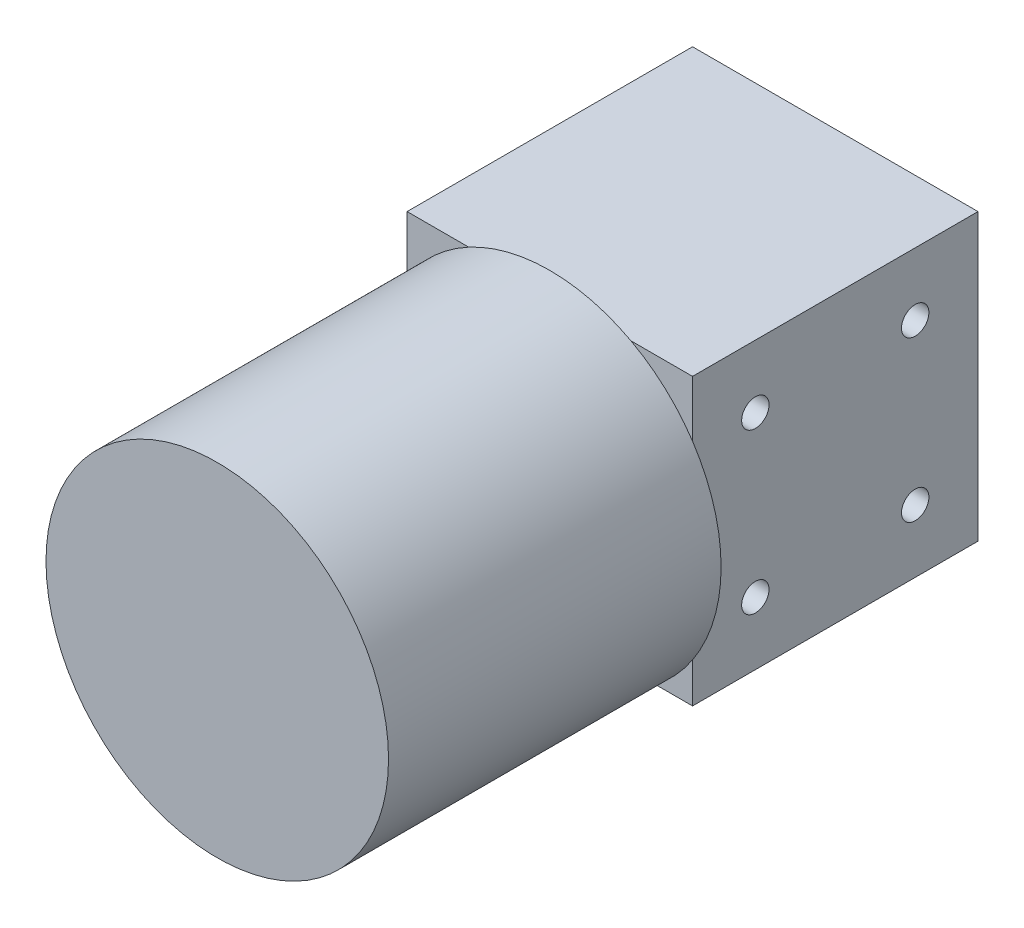
ISO-10303-21;
HEADER;
FILE_DESCRIPTION(('STEP AP214'),'2;1');
FILE_NAME('part.step','',(''),(''),'','','');
FILE_SCHEMA(('AUTOMOTIVE_DESIGN { 1 0 10303 214 1 1 1 1 }'));
ENDSEC;
DATA;
#1=APPLICATION_CONTEXT('core data for automotive mechanical design processes');
#2=APPLICATION_PROTOCOL_DEFINITION('international standard','automotive_design',2000,#1);
#3=PRODUCT_CONTEXT('',#1,'mechanical');
#4=PRODUCT('Part','Part','',(#3));
#5=PRODUCT_RELATED_PRODUCT_CATEGORY('part','',(#4));
#6=PRODUCT_DEFINITION_FORMATION('','',#4);
#7=PRODUCT_DEFINITION_CONTEXT('part definition',#1,'design');
#8=PRODUCT_DEFINITION('design','',#6,#7);
#9=PRODUCT_DEFINITION_SHAPE('','',#8);
#10=(LENGTH_UNIT() NAMED_UNIT(*) SI_UNIT(.MILLI.,.METRE.));
#11=(NAMED_UNIT(*) PLANE_ANGLE_UNIT() SI_UNIT($,.RADIAN.));
#12=(NAMED_UNIT(*) SI_UNIT($,.STERADIAN.) SOLID_ANGLE_UNIT());
#13=UNCERTAINTY_MEASURE_WITH_UNIT(LENGTH_MEASURE(1.E-05),#10,'distance_accuracy_value','');
#14=(GEOMETRIC_REPRESENTATION_CONTEXT(3) GLOBAL_UNCERTAINTY_ASSIGNED_CONTEXT((#13)) GLOBAL_UNIT_ASSIGNED_CONTEXT((#10,
#11,#12)) REPRESENTATION_CONTEXT('',''));
#15=CARTESIAN_POINT('',(0.,0.,0.));
#16=DIRECTION('',(0.,0.,1.));
#17=DIRECTION('',(1.,0.,0.));
#18=AXIS2_PLACEMENT_3D('',#15,#16,#17);
#19=CARTESIAN_POINT('',(0.,0.,50.));
#20=DIRECTION('',(0.,0.,-1.));
#21=DIRECTION('',(-1.,0.,0.));
#22=AXIS2_PLACEMENT_3D('',#19,#20,#21);
#23=PLANE('',#22);
#24=CARTESIAN_POINT('',(25.,0.,50.));
#25=DIRECTION('',(0.,0.,1.));
#26=DIRECTION('',(1.,0.,0.));
#27=AXIS2_PLACEMENT_3D('',#24,#25,#26);
#28=CIRCLE('',#27,30.);
#29=CARTESIAN_POINT('',(50.,16.583123951777,50.));
#30=VERTEX_POINT('',#29);
#31=CARTESIAN_POINT('',(39.2087450069061,26.4218009478673,50.));
#32=VERTEX_POINT('',#31);
#33=EDGE_CURVE('E134',#30,#32,#28,.T.);
#34=ORIENTED_EDGE('',*,*,#33,.F.);
#35=DIRECTION('',(0.,1.,0.));
#36=VECTOR('',#35,1.);
#37=CARTESIAN_POINT('',(50.,-23.5781990521327,50.));
#38=LINE('',#37,#36);
#39=CARTESIAN_POINT('',(50.,26.4218009478673,50.));
#40=VERTEX_POINT('',#39);
#41=EDGE_CURVE('E116',#30,#40,#38,.T.);
#42=ORIENTED_EDGE('',*,*,#41,.T.);
#43=DIRECTION('',(-1.,0.,0.));
#44=VECTOR('',#43,1.);
#45=CARTESIAN_POINT('',(0.,26.4218009478673,50.));
#46=LINE('',#45,#44);
#47=EDGE_CURVE('E164',#40,#32,#46,.T.);
#48=ORIENTED_EDGE('',*,*,#47,.T.);
#49=EDGE_LOOP('',(#34,#42,#48));
#50=FACE_BOUND('',#49,.T.);
#51=ADVANCED_FACE('F39',(#50),#23,.F.);
#52=CARTESIAN_POINT('',(10.7912549930939,26.4218009478673,50.));
#53=VERTEX_POINT('',#52);
#54=CARTESIAN_POINT('',(0.,16.583123951777,50.));
#55=VERTEX_POINT('',#54);
#56=EDGE_CURVE('E11',#53,#55,#28,.T.);
#57=ORIENTED_EDGE('',*,*,#56,.F.);
#58=CARTESIAN_POINT('',(0.,26.4218009478673,50.));
#59=VERTEX_POINT('',#58);
#60=EDGE_CURVE('E117',#53,#59,#46,.T.);
#61=ORIENTED_EDGE('',*,*,#60,.T.);
#62=DIRECTION('',(0.,-1.,0.));
#63=VECTOR('',#62,1.);
#64=CARTESIAN_POINT('',(0.,-23.5781990521327,50.));
#65=LINE('',#64,#63);
#66=EDGE_CURVE('E160',#59,#55,#65,.T.);
#67=ORIENTED_EDGE('',*,*,#66,.T.);
#68=EDGE_LOOP('',(#57,#61,#67));
#69=FACE_BOUND('',#68,.T.);
#70=ADVANCED_FACE('F189',(#69),#23,.F.);
#71=CARTESIAN_POINT('',(0.,-16.583123951777,50.));
#72=VERTEX_POINT('',#71);
#73=CARTESIAN_POINT('',(6.45091567063191,-23.5781990521327,50.));
#74=VERTEX_POINT('',#73);
#75=EDGE_CURVE('E48',#72,#74,#28,.T.);
#76=ORIENTED_EDGE('',*,*,#75,.F.);
#77=CARTESIAN_POINT('',(0.,-23.5781990521327,50.));
#78=VERTEX_POINT('',#77);
#79=EDGE_CURVE('E158',#72,#78,#65,.T.);
#80=ORIENTED_EDGE('',*,*,#79,.T.);
#81=DIRECTION('',(1.,0.,0.));
#82=VECTOR('',#81,1.);
#83=CARTESIAN_POINT('',(0.,-23.5781990521327,50.));
#84=LINE('',#83,#82);
#85=EDGE_CURVE('E161',#78,#74,#84,.T.);
#86=ORIENTED_EDGE('',*,*,#85,.T.);
#87=EDGE_LOOP('',(#76,#80,#86));
#88=FACE_BOUND('',#87,.T.);
#89=ADVANCED_FACE('F207',(#88),#23,.F.);
#90=CARTESIAN_POINT('',(0.,-23.5781990521327,50.));
#91=DIRECTION('',(1.,0.,0.));
#92=DIRECTION('',(0.,1.,0.));
#93=AXIS2_PLACEMENT_3D('',#90,#91,#92);
#94=PLANE('',#93);
#95=CARTESIAN_POINT('',(0.,-12.5781990521327,11.0000000000003));
#96=DIRECTION('',(-1.,0.,0.));
#97=DIRECTION('',(0.,-1.,0.));
#98=AXIS2_PLACEMENT_3D('',#95,#96,#97);
#99=CIRCLE('',#98,2.4);
#100=CARTESIAN_POINT('',(0.,-14.9781990521327,11.0000000000003));
#101=VERTEX_POINT('',#100);
#102=EDGE_CURVE('E443',#101,#101,#99,.T.);
#103=ORIENTED_EDGE('',*,*,#102,.F.);
#104=EDGE_LOOP('',(#103));
#105=FACE_BOUND('',#104,.T.);
#106=CARTESIAN_POINT('',(0.,-12.5781990521327,39.0000000000003));
#107=DIRECTION('',(-1.,0.,0.));
#108=DIRECTION('',(0.,-1.,0.));
#109=AXIS2_PLACEMENT_3D('',#106,#107,#108);
#110=CIRCLE('',#109,2.39999999999999);
#111=CARTESIAN_POINT('',(0.,-14.9781990521327,39.0000000000003));
#112=VERTEX_POINT('',#111);
#113=EDGE_CURVE('E566',#112,#112,#110,.T.);
#114=ORIENTED_EDGE('',*,*,#113,.F.);
#115=EDGE_LOOP('',(#114));
#116=FACE_BOUND('',#115,.T.);
#117=CARTESIAN_POINT('',(0.,15.4218009478673,39.));
#118=DIRECTION('',(-1.,0.,0.));
#119=DIRECTION('',(0.,-1.,0.));
#120=AXIS2_PLACEMENT_3D('',#117,#118,#119);
#121=CIRCLE('',#120,2.39999999999999);
#122=CARTESIAN_POINT('',(0.,13.0218009478673,39.));
#123=VERTEX_POINT('',#122);
#124=EDGE_CURVE('E459',#123,#123,#121,.T.);
#125=ORIENTED_EDGE('',*,*,#124,.F.);
#126=EDGE_LOOP('',(#125));
#127=FACE_BOUND('',#126,.T.);
#128=CARTESIAN_POINT('',(0.,15.4218009478673,11.));
#129=DIRECTION('',(-1.,0.,0.));
#130=DIRECTION('',(0.,-1.,0.));
#131=AXIS2_PLACEMENT_3D('',#128,#129,#130);
#132=CIRCLE('',#131,2.4);
#133=CARTESIAN_POINT('',(0.,13.0218009478673,11.));
#134=VERTEX_POINT('',#133);
#135=EDGE_CURVE('E457',#134,#134,#132,.T.);
#136=ORIENTED_EDGE('',*,*,#135,.F.);
#137=EDGE_LOOP('',(#136));
#138=FACE_BOUND('',#137,.T.);
#139=DIRECTION('',(0.,-1.,0.));
#140=VECTOR('',#139,1.);
#141=CARTESIAN_POINT('',(0.,-23.5781990521327,0.));
#142=LINE('',#141,#140);
#143=CARTESIAN_POINT('',(0.,26.4218009478673,0.));
#144=VERTEX_POINT('',#143);
#145=CARTESIAN_POINT('',(0.,-23.5781990521327,0.));
#146=VERTEX_POINT('',#145);
#147=EDGE_CURVE('E144',#144,#146,#142,.T.);
#148=ORIENTED_EDGE('',*,*,#147,.T.);
#149=DIRECTION('',(0.,0.,-1.));
#150=VECTOR('',#149,1.);
#151=CARTESIAN_POINT('',(0.,-23.5781990521327,50.));
#152=LINE('',#151,#150);
#153=EDGE_CURVE('E43',#78,#146,#152,.T.);
#154=ORIENTED_EDGE('',*,*,#153,.F.);
#155=ORIENTED_EDGE('',*,*,#79,.F.);
#156=EDGE_CURVE('E153',#55,#72,#65,.T.);
#157=ORIENTED_EDGE('',*,*,#156,.F.);
#158=ORIENTED_EDGE('',*,*,#66,.F.);
#159=DIRECTION('',(0.,0.,-1.));
#160=VECTOR('',#159,1.);
#161=CARTESIAN_POINT('',(0.,26.4218009478673,50.));
#162=LINE('',#161,#160);
#163=EDGE_CURVE('E170',#59,#144,#162,.T.);
#164=ORIENTED_EDGE('',*,*,#163,.T.);
#165=EDGE_LOOP('',(#148,#154,#155,#157,#158,#164));
#166=FACE_BOUND('',#165,.T.);
#167=ADVANCED_FACE('F41',(#105,#116,#127,#138,#166),#94,.F.);
#168=CARTESIAN_POINT('',(0.,-23.5781990521327,50.));
#169=DIRECTION('',(0.,1.,0.));
#170=DIRECTION('',(0.,0.,1.));
#171=AXIS2_PLACEMENT_3D('',#168,#169,#170);
#172=PLANE('',#171);
#173=DIRECTION('',(1.,0.,0.));
#174=VECTOR('',#173,1.);
#175=CARTESIAN_POINT('',(0.,-23.5781990521327,0.));
#176=LINE('',#175,#174);
#177=CARTESIAN_POINT('',(50.,-23.5781990521327,0.));
#178=VERTEX_POINT('',#177);
#179=EDGE_CURVE('E168',#146,#178,#176,.T.);
#180=ORIENTED_EDGE('',*,*,#179,.T.);
#181=DIRECTION('',(0.,0.,-1.));
#182=VECTOR('',#181,1.);
#183=CARTESIAN_POINT('',(50.,-23.5781990521327,50.));
#184=LINE('',#183,#182);
#185=CARTESIAN_POINT('',(50.,-23.5781990521327,50.));
#186=VERTEX_POINT('',#185);
#187=EDGE_CURVE('E139',#186,#178,#184,.T.);
#188=ORIENTED_EDGE('',*,*,#187,.F.);
#189=CARTESIAN_POINT('',(43.5490843293681,-23.5781990521327,50.));
#190=VERTEX_POINT('',#189);
#191=EDGE_CURVE('E115',#190,#186,#84,.T.);
#192=ORIENTED_EDGE('',*,*,#191,.F.);
#193=EDGE_CURVE('E162',#74,#190,#84,.T.);
#194=ORIENTED_EDGE('',*,*,#193,.F.);
#195=ORIENTED_EDGE('',*,*,#85,.F.);
#196=ORIENTED_EDGE('',*,*,#153,.T.);
#197=EDGE_LOOP('',(#180,#188,#192,#194,#195,#196));
#198=FACE_BOUND('',#197,.T.);
#199=ADVANCED_FACE('F221',(#198),#172,.F.);
#200=CARTESIAN_POINT('',(50.,-23.5781990521327,50.));
#201=DIRECTION('',(-1.,0.,0.));
#202=DIRECTION('',(0.,0.,1.));
#203=AXIS2_PLACEMENT_3D('',#200,#201,#202);
#204=PLANE('',#203);
#205=CARTESIAN_POINT('',(50.,-12.5781990521327,38.9999999999997));
#206=DIRECTION('',(1.,0.,0.));
#207=DIRECTION('',(0.,0.,-1.));
#208=AXIS2_PLACEMENT_3D('',#205,#206,#207);
#209=CIRCLE('',#208,2.4);
#210=CARTESIAN_POINT('',(50.,-12.5781990521327,36.5999999999997));
#211=VERTEX_POINT('',#210);
#212=EDGE_CURVE('E471',#211,#211,#209,.T.);
#213=ORIENTED_EDGE('',*,*,#212,.F.);
#214=EDGE_LOOP('',(#213));
#215=FACE_BOUND('',#214,.T.);
#216=CARTESIAN_POINT('',(50.,-12.5781990521327,10.9999999999997));
#217=DIRECTION('',(1.,0.,0.));
#218=DIRECTION('',(0.,0.,-1.));
#219=AXIS2_PLACEMENT_3D('',#216,#217,#218);
#220=CIRCLE('',#219,2.4);
#221=CARTESIAN_POINT('',(50.,-12.5781990521327,8.59999999999971));
#222=VERTEX_POINT('',#221);
#223=EDGE_CURVE('E470',#222,#222,#220,.T.);
#224=ORIENTED_EDGE('',*,*,#223,.F.);
#225=EDGE_LOOP('',(#224));
#226=FACE_BOUND('',#225,.T.);
#227=CARTESIAN_POINT('',(50.,15.4218009478673,11.));
#228=DIRECTION('',(1.,0.,0.));
#229=DIRECTION('',(0.,0.,-1.));
#230=AXIS2_PLACEMENT_3D('',#227,#228,#229);
#231=CIRCLE('',#230,2.4);
#232=CARTESIAN_POINT('',(50.,15.4218009478673,8.6));
#233=VERTEX_POINT('',#232);
#234=EDGE_CURVE('E458',#233,#233,#231,.T.);
#235=ORIENTED_EDGE('',*,*,#234,.F.);
#236=EDGE_LOOP('',(#235));
#237=FACE_BOUND('',#236,.T.);
#238=CARTESIAN_POINT('',(50.,15.4218009478673,39.));
#239=DIRECTION('',(1.,0.,0.));
#240=DIRECTION('',(0.,0.,-1.));
#241=AXIS2_PLACEMENT_3D('',#238,#239,#240);
#242=CIRCLE('',#241,2.4);
#243=CARTESIAN_POINT('',(50.,15.4218009478673,36.6));
#244=VERTEX_POINT('',#243);
#245=EDGE_CURVE('E464',#244,#244,#242,.T.);
#246=ORIENTED_EDGE('',*,*,#245,.F.);
#247=EDGE_LOOP('',(#246));
#248=FACE_BOUND('',#247,.T.);
#249=DIRECTION('',(0.,1.,0.));
#250=VECTOR('',#249,1.);
#251=CARTESIAN_POINT('',(50.,-23.5781990521327,0.));
#252=LINE('',#251,#250);
#253=CARTESIAN_POINT('',(50.,26.4218009478673,0.));
#254=VERTEX_POINT('',#253);
#255=EDGE_CURVE('E175',#178,#254,#252,.T.);
#256=ORIENTED_EDGE('',*,*,#255,.T.);
#257=DIRECTION('',(0.,0.,-1.));
#258=VECTOR('',#257,1.);
#259=CARTESIAN_POINT('',(50.,26.4218009478673,50.));
#260=LINE('',#259,#258);
#261=EDGE_CURVE('E180',#40,#254,#260,.T.);
#262=ORIENTED_EDGE('',*,*,#261,.F.);
#263=ORIENTED_EDGE('',*,*,#41,.F.);
#264=CARTESIAN_POINT('',(50.,-16.583123951777,50.));
#265=VERTEX_POINT('',#264);
#266=EDGE_CURVE('E120',#265,#30,#38,.T.);
#267=ORIENTED_EDGE('',*,*,#266,.F.);
#268=EDGE_CURVE('E106',#186,#265,#38,.T.);
#269=ORIENTED_EDGE('',*,*,#268,.F.);
#270=ORIENTED_EDGE('',*,*,#187,.T.);
#271=EDGE_LOOP('',(#256,#262,#263,#267,#269,#270));
#272=FACE_BOUND('',#271,.T.);
#273=ADVANCED_FACE('F123',(#215,#226,#237,#248,#272),#204,.F.);
#274=CARTESIAN_POINT('',(0.,26.4218009478673,50.));
#275=DIRECTION('',(0.,-1.,0.));
#276=DIRECTION('',(0.,0.,-1.));
#277=AXIS2_PLACEMENT_3D('',#274,#275,#276);
#278=PLANE('',#277);
#279=DIRECTION('',(-1.,0.,0.));
#280=VECTOR('',#279,1.);
#281=CARTESIAN_POINT('',(0.,26.4218009478673,0.));
#282=LINE('',#281,#280);
#283=EDGE_CURVE('E157',#254,#144,#282,.T.);
#284=ORIENTED_EDGE('',*,*,#283,.T.);
#285=ORIENTED_EDGE('',*,*,#163,.F.);
#286=ORIENTED_EDGE('',*,*,#60,.F.);
#287=EDGE_CURVE('E65',#32,#53,#46,.T.);
#288=ORIENTED_EDGE('',*,*,#287,.F.);
#289=ORIENTED_EDGE('',*,*,#47,.F.);
#290=ORIENTED_EDGE('',*,*,#261,.T.);
#291=EDGE_LOOP('',(#284,#285,#286,#288,#289,#290));
#292=FACE_BOUND('',#291,.T.);
#293=ADVANCED_FACE('F187',(#292),#278,.F.);
#294=EDGE_CURVE('E109',#190,#265,#28,.T.);
#295=ORIENTED_EDGE('',*,*,#294,.F.);
#296=ORIENTED_EDGE('',*,*,#191,.T.);
#297=ORIENTED_EDGE('',*,*,#268,.T.);
#298=EDGE_LOOP('',(#295,#296,#297));
#299=FACE_BOUND('',#298,.T.);
#300=ADVANCED_FACE('F107',(#299),#23,.F.);
#301=CARTESIAN_POINT('',(0.,0.,0.));
#302=DIRECTION('',(0.,0.,-1.));
#303=DIRECTION('',(-1.,0.,0.));
#304=AXIS2_PLACEMENT_3D('',#301,#302,#303);
#305=PLANE('',#304);
#306=CARTESIAN_POINT('',(25.,0.,0.));
#307=DIRECTION('',(0.,0.,-1.));
#308=DIRECTION('',(-1.,0.,0.));
#309=AXIS2_PLACEMENT_3D('',#306,#307,#308);
#310=CIRCLE('',#309,7.5);
#311=CARTESIAN_POINT('',(17.5,0.,0.));
#312=VERTEX_POINT('',#311);
#313=EDGE_CURVE('E481',#312,#312,#310,.T.);
#314=ORIENTED_EDGE('',*,*,#313,.F.);
#315=EDGE_LOOP('',(#314));
#316=FACE_BOUND('',#315,.T.);
#317=ORIENTED_EDGE('',*,*,#147,.F.);
#318=ORIENTED_EDGE('',*,*,#283,.F.);
#319=ORIENTED_EDGE('',*,*,#255,.F.);
#320=ORIENTED_EDGE('',*,*,#179,.F.);
#321=EDGE_LOOP('',(#317,#318,#319,#320));
#322=FACE_BOUND('',#321,.T.);
#323=ADVANCED_FACE('F184',(#316,#322),#305,.T.);
#324=CARTESIAN_POINT('',(25.,0.,50.));
#325=DIRECTION('',(0.,0.,1.));
#326=DIRECTION('',(1.,0.,0.));
#327=AXIS2_PLACEMENT_3D('',#324,#325,#326);
#328=PLANE('',#327);
#329=EDGE_CURVE('E148',#55,#72,#28,.T.);
#330=ORIENTED_EDGE('',*,*,#329,.F.);
#331=ORIENTED_EDGE('',*,*,#156,.T.);
#332=EDGE_LOOP('',(#330,#331));
#333=FACE_BOUND('',#332,.T.);
#334=ADVANCED_FACE('F155',(#333),#328,.F.);
#335=EDGE_CURVE('E132',#74,#190,#28,.T.);
#336=ORIENTED_EDGE('',*,*,#335,.F.);
#337=ORIENTED_EDGE('',*,*,#193,.T.);
#338=EDGE_LOOP('',(#336,#337));
#339=FACE_BOUND('',#338,.T.);
#340=ADVANCED_FACE('F199',(#339),#328,.F.);
#341=EDGE_CURVE('E130',#265,#30,#28,.T.);
#342=ORIENTED_EDGE('',*,*,#341,.F.);
#343=ORIENTED_EDGE('',*,*,#266,.T.);
#344=EDGE_LOOP('',(#342,#343));
#345=FACE_BOUND('',#344,.T.);
#346=ADVANCED_FACE('F126',(#345),#328,.F.);
#347=EDGE_CURVE('E49',#32,#53,#28,.T.);
#348=ORIENTED_EDGE('',*,*,#347,.F.);
#349=ORIENTED_EDGE('',*,*,#287,.T.);
#350=EDGE_LOOP('',(#348,#349));
#351=FACE_BOUND('',#350,.T.);
#352=ADVANCED_FACE('F188',(#351),#328,.F.);
#353=CARTESIAN_POINT('',(25.,0.,108.25));
#354=DIRECTION('',(0.,0.,-1.));
#355=DIRECTION('',(-1.,0.,0.));
#356=AXIS2_PLACEMENT_3D('',#353,#354,#355);
#357=CYLINDRICAL_SURFACE('',#356,30.);
#358=CARTESIAN_POINT('',(25.,0.,108.25));
#359=DIRECTION('',(0.,0.,1.));
#360=DIRECTION('',(1.,0.,0.));
#361=AXIS2_PLACEMENT_3D('',#358,#359,#360);
#362=CIRCLE('',#361,30.);
#363=CARTESIAN_POINT('',(55.,0.,108.25));
#364=VERTEX_POINT('',#363);
#365=EDGE_CURVE('E142',#364,#364,#362,.T.);
#366=ORIENTED_EDGE('',*,*,#365,.F.);
#367=EDGE_LOOP('',(#366));
#368=FACE_BOUND('',#367,.T.);
#369=ORIENTED_EDGE('',*,*,#33,.T.);
#370=ORIENTED_EDGE('',*,*,#347,.T.);
#371=ORIENTED_EDGE('',*,*,#56,.T.);
#372=ORIENTED_EDGE('',*,*,#329,.T.);
#373=ORIENTED_EDGE('',*,*,#75,.T.);
#374=ORIENTED_EDGE('',*,*,#335,.T.);
#375=ORIENTED_EDGE('',*,*,#294,.T.);
#376=ORIENTED_EDGE('',*,*,#341,.T.);
#377=EDGE_LOOP('',(#369,#370,#371,#372,#373,#374,#375,#376));
#378=FACE_BOUND('',#377,.T.);
#379=ADVANCED_FACE('F133',(#368,#378),#357,.T.);
#380=CARTESIAN_POINT('',(25.,0.,108.25));
#381=DIRECTION('',(0.,0.,1.));
#382=DIRECTION('',(1.,0.,0.));
#383=AXIS2_PLACEMENT_3D('',#380,#381,#382);
#384=PLANE('',#383);
#385=ORIENTED_EDGE('',*,*,#365,.T.);
#386=EDGE_LOOP('',(#385));
#387=FACE_BOUND('',#386,.T.);
#388=ADVANCED_FACE('F197',(#387),#384,.T.);
#389=CARTESIAN_POINT('',(25.,0.,1.));
#390=DIRECTION('',(0.,0.,-1.));
#391=DIRECTION('',(-1.,0.,0.));
#392=AXIS2_PLACEMENT_3D('',#389,#390,#391);
#393=CYLINDRICAL_SURFACE('',#392,7.5);
#394=CARTESIAN_POINT('',(25.,0.,1.));
#395=DIRECTION('',(0.,0.,-1.));
#396=DIRECTION('',(-1.,0.,0.));
#397=AXIS2_PLACEMENT_3D('',#394,#395,#396);
#398=CIRCLE('',#397,7.5);
#399=CARTESIAN_POINT('',(17.5,0.,1.));
#400=VERTEX_POINT('',#399);
#401=EDGE_CURVE('E135',#400,#400,#398,.T.);
#402=ORIENTED_EDGE('',*,*,#401,.F.);
#403=EDGE_LOOP('',(#402));
#404=FACE_BOUND('',#403,.T.);
#405=ORIENTED_EDGE('',*,*,#313,.T.);
#406=EDGE_LOOP('',(#405));
#407=FACE_BOUND('',#406,.T.);
#408=ADVANCED_FACE('F259',(#404,#407),#393,.F.);
#409=CARTESIAN_POINT('',(25.,0.,1.));
#410=DIRECTION('',(0.,0.,-1.));
#411=DIRECTION('',(-1.,0.,0.));
#412=AXIS2_PLACEMENT_3D('',#409,#410,#411);
#413=PLANE('',#412);
#414=ORIENTED_EDGE('',*,*,#401,.T.);
#415=EDGE_LOOP('',(#414));
#416=FACE_BOUND('',#415,.T.);
#417=ADVANCED_FACE('F268',(#416),#413,.T.);
#418=CARTESIAN_POINT('',(35.,15.4218009478673,39.));
#419=DIRECTION('',(1.,0.,0.));
#420=DIRECTION('',(0.,0.,-1.));
#421=AXIS2_PLACEMENT_3D('',#418,#419,#420);
#422=CYLINDRICAL_SURFACE('',#421,2.4);
#423=CARTESIAN_POINT('',(35.,15.4218009478673,39.));
#424=DIRECTION('',(1.,0.,0.));
#425=DIRECTION('',(0.,0.,-1.));
#426=AXIS2_PLACEMENT_3D('',#423,#424,#425);
#427=CIRCLE('',#426,2.4);
#428=CARTESIAN_POINT('',(35.,15.4218009478673,36.6));
#429=VERTEX_POINT('',#428);
#430=EDGE_CURVE('E476',#429,#429,#427,.T.);
#431=ORIENTED_EDGE('',*,*,#430,.F.);
#432=EDGE_LOOP('',(#431));
#433=FACE_BOUND('',#432,.T.);
#434=ORIENTED_EDGE('',*,*,#245,.T.);
#435=EDGE_LOOP('',(#434));
#436=FACE_BOUND('',#435,.T.);
#437=ADVANCED_FACE('F279',(#433,#436),#422,.F.);
#438=CARTESIAN_POINT('',(35.,15.4218009478673,39.));
#439=DIRECTION('',(1.,0.,0.));
#440=DIRECTION('',(0.,0.,-1.));
#441=AXIS2_PLACEMENT_3D('',#438,#439,#440);
#442=PLANE('',#441);
#443=ORIENTED_EDGE('',*,*,#430,.T.);
#444=EDGE_LOOP('',(#443));
#445=FACE_BOUND('',#444,.T.);
#446=ADVANCED_FACE('F289',(#445),#442,.T.);
#447=CARTESIAN_POINT('',(35.,15.4218009478673,11.));
#448=DIRECTION('',(1.,0.,0.));
#449=DIRECTION('',(0.,0.,-1.));
#450=AXIS2_PLACEMENT_3D('',#447,#448,#449);
#451=CYLINDRICAL_SURFACE('',#450,2.4);
#452=CARTESIAN_POINT('',(35.,15.4218009478673,11.));
#453=DIRECTION('',(1.,0.,0.));
#454=DIRECTION('',(0.,0.,-1.));
#455=AXIS2_PLACEMENT_3D('',#452,#453,#454);
#456=CIRCLE('',#455,2.4);
#457=CARTESIAN_POINT('',(35.,15.4218009478673,8.6));
#458=VERTEX_POINT('',#457);
#459=EDGE_CURVE('E461',#458,#458,#456,.T.);
#460=ORIENTED_EDGE('',*,*,#459,.F.);
#461=EDGE_LOOP('',(#460));
#462=FACE_BOUND('',#461,.T.);
#463=ORIENTED_EDGE('',*,*,#234,.T.);
#464=EDGE_LOOP('',(#463));
#465=FACE_BOUND('',#464,.T.);
#466=ADVANCED_FACE('F296',(#462,#465),#451,.F.);
#467=CARTESIAN_POINT('',(35.,15.4218009478673,11.));
#468=DIRECTION('',(1.,0.,0.));
#469=DIRECTION('',(0.,0.,-1.));
#470=AXIS2_PLACEMENT_3D('',#467,#468,#469);
#471=PLANE('',#470);
#472=ORIENTED_EDGE('',*,*,#459,.T.);
#473=EDGE_LOOP('',(#472));
#474=FACE_BOUND('',#473,.T.);
#475=ADVANCED_FACE('F310',(#474),#471,.T.);
#476=CARTESIAN_POINT('',(35.,-12.5781990521327,10.9999999999997));
#477=DIRECTION('',(1.,0.,0.));
#478=DIRECTION('',(0.,0.,-1.));
#479=AXIS2_PLACEMENT_3D('',#476,#477,#478);
#480=CYLINDRICAL_SURFACE('',#479,2.4);
#481=CARTESIAN_POINT('',(35.,-12.5781990521327,10.9999999999997));
#482=DIRECTION('',(1.,0.,0.));
#483=DIRECTION('',(0.,0.,-1.));
#484=AXIS2_PLACEMENT_3D('',#481,#482,#483);
#485=CIRCLE('',#484,2.4);
#486=CARTESIAN_POINT('',(35.,-12.5781990521327,8.59999999999971));
#487=VERTEX_POINT('',#486);
#488=EDGE_CURVE('E466',#487,#487,#485,.T.);
#489=ORIENTED_EDGE('',*,*,#488,.F.);
#490=EDGE_LOOP('',(#489));
#491=FACE_BOUND('',#490,.T.);
#492=ORIENTED_EDGE('',*,*,#223,.T.);
#493=EDGE_LOOP('',(#492));
#494=FACE_BOUND('',#493,.T.);
#495=ADVANCED_FACE('F317',(#491,#494),#480,.F.);
#496=CARTESIAN_POINT('',(35.,-12.5781990521327,10.9999999999997));
#497=DIRECTION('',(1.,0.,0.));
#498=DIRECTION('',(0.,0.,-1.));
#499=AXIS2_PLACEMENT_3D('',#496,#497,#498);
#500=PLANE('',#499);
#501=ORIENTED_EDGE('',*,*,#488,.T.);
#502=EDGE_LOOP('',(#501));
#503=FACE_BOUND('',#502,.T.);
#504=ADVANCED_FACE('F328',(#503),#500,.T.);
#505=CARTESIAN_POINT('',(35.,-12.5781990521327,38.9999999999997));
#506=DIRECTION('',(1.,0.,0.));
#507=DIRECTION('',(0.,0.,-1.));
#508=AXIS2_PLACEMENT_3D('',#505,#506,#507);
#509=CYLINDRICAL_SURFACE('',#508,2.4);
#510=CARTESIAN_POINT('',(35.,-12.5781990521327,38.9999999999997));
#511=DIRECTION('',(1.,0.,0.));
#512=DIRECTION('',(0.,0.,-1.));
#513=AXIS2_PLACEMENT_3D('',#510,#511,#512);
#514=CIRCLE('',#513,2.4);
#515=CARTESIAN_POINT('',(35.,-12.5781990521327,36.5999999999997));
#516=VERTEX_POINT('',#515);
#517=EDGE_CURVE('E451',#516,#516,#514,.T.);
#518=ORIENTED_EDGE('',*,*,#517,.F.);
#519=EDGE_LOOP('',(#518));
#520=FACE_BOUND('',#519,.T.);
#521=ORIENTED_EDGE('',*,*,#212,.T.);
#522=EDGE_LOOP('',(#521));
#523=FACE_BOUND('',#522,.T.);
#524=ADVANCED_FACE('F336',(#520,#523),#509,.F.);
#525=CARTESIAN_POINT('',(35.,-12.5781990521327,38.9999999999997));
#526=DIRECTION('',(1.,0.,0.));
#527=DIRECTION('',(0.,0.,-1.));
#528=AXIS2_PLACEMENT_3D('',#525,#526,#527);
#529=PLANE('',#528);
#530=ORIENTED_EDGE('',*,*,#517,.T.);
#531=EDGE_LOOP('',(#530));
#532=FACE_BOUND('',#531,.T.);
#533=ADVANCED_FACE('F349',(#532),#529,.T.);
#534=CARTESIAN_POINT('',(15.,15.4218009478673,11.));
#535=DIRECTION('',(-1.,0.,0.));
#536=DIRECTION('',(0.,-1.,0.));
#537=AXIS2_PLACEMENT_3D('',#534,#535,#536);
#538=CYLINDRICAL_SURFACE('',#537,2.4);
#539=CARTESIAN_POINT('',(15.,15.4218009478673,11.));
#540=DIRECTION('',(-1.,0.,0.));
#541=DIRECTION('',(0.,-1.,0.));
#542=AXIS2_PLACEMENT_3D('',#539,#540,#541);
#543=CIRCLE('',#542,2.4);
#544=CARTESIAN_POINT('',(15.,13.0218009478673,11.));
#545=VERTEX_POINT('',#544);
#546=EDGE_CURVE('E455',#545,#545,#543,.T.);
#547=ORIENTED_EDGE('',*,*,#546,.F.);
#548=EDGE_LOOP('',(#547));
#549=FACE_BOUND('',#548,.T.);
#550=ORIENTED_EDGE('',*,*,#135,.T.);
#551=EDGE_LOOP('',(#550));
#552=FACE_BOUND('',#551,.T.);
#553=ADVANCED_FACE('F359',(#549,#552),#538,.F.);
#554=CARTESIAN_POINT('',(15.,15.4218009478673,11.));
#555=DIRECTION('',(-1.,0.,0.));
#556=DIRECTION('',(0.,-1.,0.));
#557=AXIS2_PLACEMENT_3D('',#554,#555,#556);
#558=PLANE('',#557);
#559=ORIENTED_EDGE('',*,*,#546,.T.);
#560=EDGE_LOOP('',(#559));
#561=FACE_BOUND('',#560,.T.);
#562=ADVANCED_FACE('F369',(#561),#558,.T.);
#563=CARTESIAN_POINT('',(15.,15.4218009478673,39.));
#564=DIRECTION('',(-1.,0.,0.));
#565=DIRECTION('',(0.,-1.,0.));
#566=AXIS2_PLACEMENT_3D('',#563,#564,#565);
#567=CYLINDRICAL_SURFACE('',#566,2.39999999999999);
#568=CARTESIAN_POINT('',(15.,15.4218009478673,39.));
#569=DIRECTION('',(-1.,0.,0.));
#570=DIRECTION('',(0.,-1.,0.));
#571=AXIS2_PLACEMENT_3D('',#568,#569,#570);
#572=CIRCLE('',#571,2.39999999999999);
#573=CARTESIAN_POINT('',(15.,13.0218009478673,39.));
#574=VERTEX_POINT('',#573);
#575=EDGE_CURVE('E563',#574,#574,#572,.T.);
#576=ORIENTED_EDGE('',*,*,#575,.F.);
#577=EDGE_LOOP('',(#576));
#578=FACE_BOUND('',#577,.T.);
#579=ORIENTED_EDGE('',*,*,#124,.T.);
#580=EDGE_LOOP('',(#579));
#581=FACE_BOUND('',#580,.T.);
#582=ADVANCED_FACE('F377',(#578,#581),#567,.F.);
#583=CARTESIAN_POINT('',(15.,15.4218009478673,39.));
#584=DIRECTION('',(-1.,0.,0.));
#585=DIRECTION('',(0.,-1.,0.));
#586=AXIS2_PLACEMENT_3D('',#583,#584,#585);
#587=PLANE('',#586);
#588=ORIENTED_EDGE('',*,*,#575,.T.);
#589=EDGE_LOOP('',(#588));
#590=FACE_BOUND('',#589,.T.);
#591=ADVANCED_FACE('F386',(#590),#587,.T.);
#592=CARTESIAN_POINT('',(15.,-12.5781990521327,39.0000000000003));
#593=DIRECTION('',(-1.,0.,0.));
#594=DIRECTION('',(0.,-1.,0.));
#595=AXIS2_PLACEMENT_3D('',#592,#593,#594);
#596=CYLINDRICAL_SURFACE('',#595,2.39999999999999);
#597=CARTESIAN_POINT('',(15.,-12.5781990521327,39.0000000000003));
#598=DIRECTION('',(-1.,0.,0.));
#599=DIRECTION('',(0.,-1.,0.));
#600=AXIS2_PLACEMENT_3D('',#597,#598,#599);
#601=CIRCLE('',#600,2.39999999999999);
#602=CARTESIAN_POINT('',(15.,-14.9781990521327,39.0000000000003));
#603=VERTEX_POINT('',#602);
#604=EDGE_CURVE('E449',#603,#603,#601,.T.);
#605=ORIENTED_EDGE('',*,*,#604,.F.);
#606=EDGE_LOOP('',(#605));
#607=FACE_BOUND('',#606,.T.);
#608=ORIENTED_EDGE('',*,*,#113,.T.);
#609=EDGE_LOOP('',(#608));
#610=FACE_BOUND('',#609,.T.);
#611=ADVANCED_FACE('F399',(#607,#610),#596,.F.);
#612=CARTESIAN_POINT('',(15.,-12.5781990521327,39.0000000000003));
#613=DIRECTION('',(-1.,0.,0.));
#614=DIRECTION('',(0.,-1.,0.));
#615=AXIS2_PLACEMENT_3D('',#612,#613,#614);
#616=PLANE('',#615);
#617=ORIENTED_EDGE('',*,*,#604,.T.);
#618=EDGE_LOOP('',(#617));
#619=FACE_BOUND('',#618,.T.);
#620=ADVANCED_FACE('F406',(#619),#616,.T.);
#621=CARTESIAN_POINT('',(15.,-12.5781990521327,11.0000000000003));
#622=DIRECTION('',(-1.,0.,0.));
#623=DIRECTION('',(0.,-1.,0.));
#624=AXIS2_PLACEMENT_3D('',#621,#622,#623);
#625=CYLINDRICAL_SURFACE('',#624,2.4);
#626=CARTESIAN_POINT('',(15.,-12.5781990521327,11.0000000000003));
#627=DIRECTION('',(-1.,0.,0.));
#628=DIRECTION('',(0.,-1.,0.));
#629=AXIS2_PLACEMENT_3D('',#626,#627,#628);
#630=CIRCLE('',#629,2.4);
#631=CARTESIAN_POINT('',(15.,-14.9781990521327,11.0000000000003));
#632=VERTEX_POINT('',#631);
#633=EDGE_CURVE('E441',#632,#632,#630,.T.);
#634=ORIENTED_EDGE('',*,*,#633,.F.);
#635=EDGE_LOOP('',(#634));
#636=FACE_BOUND('',#635,.T.);
#637=ORIENTED_EDGE('',*,*,#102,.T.);
#638=EDGE_LOOP('',(#637));
#639=FACE_BOUND('',#638,.T.);
#640=ADVANCED_FACE('F420',(#636,#639),#625,.F.);
#641=CARTESIAN_POINT('',(15.,-12.5781990521327,11.0000000000003));
#642=DIRECTION('',(-1.,0.,0.));
#643=DIRECTION('',(0.,-1.,0.));
#644=AXIS2_PLACEMENT_3D('',#641,#642,#643);
#645=PLANE('',#644);
#646=ORIENTED_EDGE('',*,*,#633,.T.);
#647=EDGE_LOOP('',(#646));
#648=FACE_BOUND('',#647,.T.);
#649=ADVANCED_FACE('F427',(#648),#645,.T.);
#650=CLOSED_SHELL('',(#51,#70,#89,#167,#199,#273,#293,#300,#323,#334,#340,#346,#352,#379,#388,
#408,#417,#437,#446,#466,#475,#495,#504,#524,#533,#553,#562,#582,#591,#611,#620,#640,#649));
#651=MANIFOLD_SOLID_BREP('B2',#650);
#652=ADVANCED_BREP_SHAPE_REPRESENTATION('',(#18,#651),#14);
#653=SHAPE_DEFINITION_REPRESENTATION(#9,#652);
ENDSEC;
END-ISO-10303-21;
